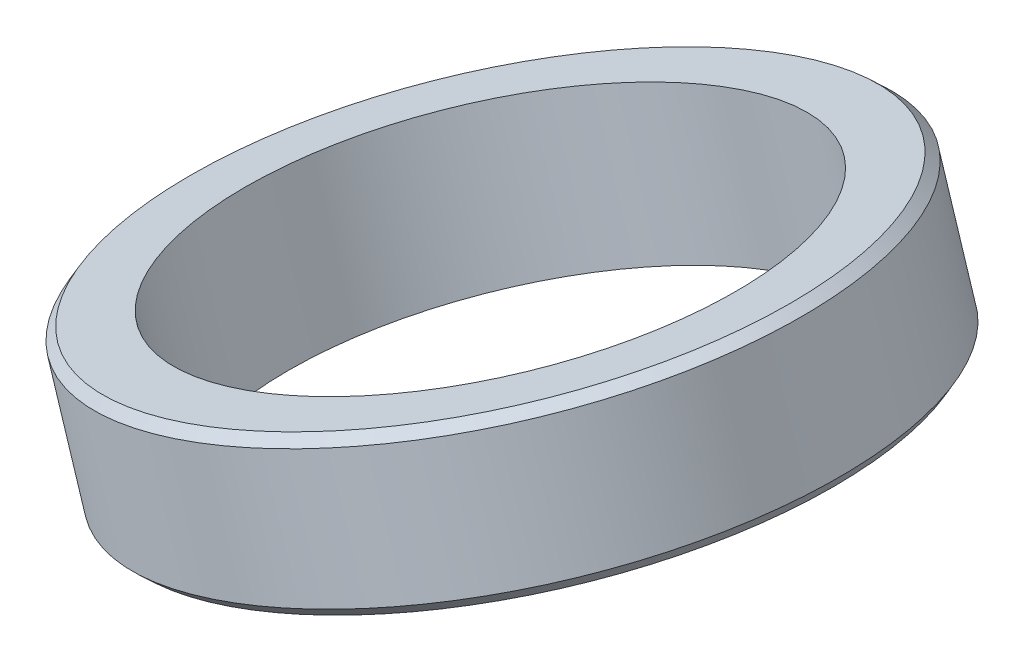
ISO-10303-21;
HEADER;
FILE_DESCRIPTION(('STEP AP214'),'2;1');
FILE_NAME('part.step','',(''),(''),'','','');
FILE_SCHEMA(('AUTOMOTIVE_DESIGN { 1 0 10303 214 1 1 1 1 }'));
ENDSEC;
DATA;
#1=APPLICATION_CONTEXT('core data for automotive mechanical design processes');
#2=APPLICATION_PROTOCOL_DEFINITION('international standard','automotive_design',2000,#1);
#3=PRODUCT_CONTEXT('',#1,'mechanical');
#4=PRODUCT('Part','Part','',(#3));
#5=PRODUCT_RELATED_PRODUCT_CATEGORY('part','',(#4));
#6=PRODUCT_DEFINITION_FORMATION('','',#4);
#7=PRODUCT_DEFINITION_CONTEXT('part definition',#1,'design');
#8=PRODUCT_DEFINITION('design','',#6,#7);
#9=PRODUCT_DEFINITION_SHAPE('','',#8);
#10=(LENGTH_UNIT() NAMED_UNIT(*) SI_UNIT(.MILLI.,.METRE.));
#11=(NAMED_UNIT(*) PLANE_ANGLE_UNIT() SI_UNIT($,.RADIAN.));
#12=(NAMED_UNIT(*) SI_UNIT($,.STERADIAN.) SOLID_ANGLE_UNIT());
#13=UNCERTAINTY_MEASURE_WITH_UNIT(LENGTH_MEASURE(1.E-05),#10,'distance_accuracy_value','');
#14=(GEOMETRIC_REPRESENTATION_CONTEXT(3) GLOBAL_UNCERTAINTY_ASSIGNED_CONTEXT((#13)) GLOBAL_UNIT_ASSIGNED_CONTEXT((#10,
#11,#12)) REPRESENTATION_CONTEXT('',''));
#15=CARTESIAN_POINT('',(0.,0.,0.));
#16=DIRECTION('',(0.,0.,1.));
#17=DIRECTION('',(1.,0.,0.));
#18=AXIS2_PLACEMENT_3D('',#15,#16,#17);
#19=CARTESIAN_POINT('',(355.271428694169,565.0485710393,0.));
#20=DIRECTION('',(-0.300714282645771,0.953714275982508,0.));
#21=DIRECTION('',(-0.953714275982508,-0.300714282645771,0.));
#22=AXIS2_PLACEMENT_3D('',#19,#20,#21);
#23=CYLINDRICAL_SURFACE('',#22,14.3);
#24=CARTESIAN_POINT('',(359.180714368564,552.650285451528,0.));
#25=DIRECTION('',(-0.300714282645771,0.953714275982508,0.));
#26=DIRECTION('',(-0.953714275982508,-0.300714282645771,0.));
#27=AXIS2_PLACEMENT_3D('',#24,#25,#26);
#28=CIRCLE('',#27,14.3);
#29=CARTESIAN_POINT('',(345.542600222014,548.350071209693,0.));
#30=VERTEX_POINT('',#29);
#31=EDGE_CURVE('E55',#30,#30,#28,.T.);
#32=ORIENTED_EDGE('',*,*,#31,.F.);
#33=EDGE_LOOP('',(#32));
#34=FACE_BOUND('',#33,.T.);
#35=CARTESIAN_POINT('',(356.775000107398,560.279999659388,0.));
#36=DIRECTION('',(-0.300714282645771,0.953714275982508,0.));
#37=DIRECTION('',(-0.953714275982508,-0.300714282645771,0.));
#38=AXIS2_PLACEMENT_3D('',#35,#36,#37);
#39=CIRCLE('',#38,14.3);
#40=CARTESIAN_POINT('',(343.136885960848,555.979785417553,0.));
#41=VERTEX_POINT('',#40);
#42=EDGE_CURVE('E10',#41,#41,#39,.T.);
#43=ORIENTED_EDGE('',*,*,#42,.T.);
#44=EDGE_LOOP('',(#43));
#45=FACE_BOUND('',#44,.T.);
#46=ADVANCED_FACE('F33',(#34,#45),#23,.F.);
#47=CARTESIAN_POINT('',(370.413114253948,564.580213901222,0.));
#48=DIRECTION('',(0.300714282645771,-0.953714275982508,0.));
#49=DIRECTION('',(0.953714275982508,0.300714282645771,0.));
#50=AXIS2_PLACEMENT_3D('',#47,#48,#49);
#51=PLANE('',#50);
#52=ORIENTED_EDGE('',*,*,#42,.F.);
#53=EDGE_LOOP('',(#52));
#54=FACE_BOUND('',#53,.T.);
#55=CARTESIAN_POINT('',(356.775000107398,560.279999659388,0.));
#56=DIRECTION('',(-0.300714282645771,0.953714275982508,0.));
#57=DIRECTION('',(-0.953714275982508,-0.300714282645771,0.));
#58=AXIS2_PLACEMENT_3D('',#55,#56,#57);
#59=CIRCLE('',#58,17.5);
#60=CARTESIAN_POINT('',(340.085000277704,555.017499713087,0.));
#61=VERTEX_POINT('',#60);
#62=EDGE_CURVE('E39',#61,#61,#59,.T.);
#63=ORIENTED_EDGE('',*,*,#62,.T.);
#64=EDGE_LOOP('',(#63));
#65=FACE_BOUND('',#64,.T.);
#66=ADVANCED_FACE('F62',(#54,#65),#51,.F.);
#67=CARTESIAN_POINT('',(356.925357248721,559.803142521396,0.));
#68=DIRECTION('',(0.300714282645771,-0.953714275982508,0.));
#69=DIRECTION('',(0.953714275982508,0.300714282645771,0.));
#70=AXIS2_PLACEMENT_3D('',#67,#68,#69);
#71=CONICAL_SURFACE('',#70,18.,0.785398163397482);
#72=ORIENTED_EDGE('',*,*,#62,.F.);
#73=EDGE_LOOP('',(#72));
#74=FACE_BOUND('',#73,.T.);
#75=CARTESIAN_POINT('',(356.925357248721,559.803142521396,0.));
#76=DIRECTION('',(-0.300714282645771,0.953714275982508,0.));
#77=DIRECTION('',(-0.953714275982508,-0.300714282645771,0.));
#78=AXIS2_PLACEMENT_3D('',#75,#76,#77);
#79=CIRCLE('',#78,18.);
#80=CARTESIAN_POINT('',(339.758500281036,554.390285433773,0.));
#81=VERTEX_POINT('',#80);
#82=EDGE_CURVE('E43',#81,#81,#79,.T.);
#83=ORIENTED_EDGE('',*,*,#82,.T.);
#84=EDGE_LOOP('',(#83));
#85=FACE_BOUND('',#84,.T.);
#86=ADVANCED_FACE('F66',(#74,#85),#71,.T.);
#87=CARTESIAN_POINT('',(355.271428694169,565.0485710393,0.));
#88=DIRECTION('',(-0.300714282645771,0.953714275982508,0.));
#89=DIRECTION('',(-0.953714275982508,-0.300714282645771,0.));
#90=AXIS2_PLACEMENT_3D('',#87,#88,#89);
#91=CYLINDRICAL_SURFACE('',#90,18.);
#92=ORIENTED_EDGE('',*,*,#82,.F.);
#93=EDGE_LOOP('',(#92));
#94=FACE_BOUND('',#93,.T.);
#95=CARTESIAN_POINT('',(359.030357227241,553.127142589519,0.));
#96=DIRECTION('',(-0.300714282645771,0.953714275982508,0.));
#97=DIRECTION('',(-0.953714275982508,-0.300714282645771,0.));
#98=AXIS2_PLACEMENT_3D('',#95,#96,#97);
#99=CIRCLE('',#98,18.);
#100=CARTESIAN_POINT('',(341.863500259556,547.714285501895,0.));
#101=VERTEX_POINT('',#100);
#102=EDGE_CURVE('E47',#101,#101,#99,.T.);
#103=ORIENTED_EDGE('',*,*,#102,.T.);
#104=EDGE_LOOP('',(#103));
#105=FACE_BOUND('',#104,.T.);
#106=ADVANCED_FACE('F71',(#94,#105),#91,.T.);
#107=CARTESIAN_POINT('',(359.180714368564,552.650285451528,0.));
#108=DIRECTION('',(-0.300714282645771,0.953714275982508,0.));
#109=DIRECTION('',(-0.953714275982508,-0.300714282645771,0.));
#110=AXIS2_PLACEMENT_3D('',#107,#108,#109);
#111=CONICAL_SURFACE('',#110,17.5,0.785398163397326);
#112=ORIENTED_EDGE('',*,*,#102,.F.);
#113=EDGE_LOOP('',(#112));
#114=FACE_BOUND('',#113,.T.);
#115=CARTESIAN_POINT('',(359.180714368564,552.650285451528,0.));
#116=DIRECTION('',(-0.300714282645771,0.953714275982508,0.));
#117=DIRECTION('',(-0.953714275982508,-0.300714282645771,0.));
#118=AXIS2_PLACEMENT_3D('',#115,#116,#117);
#119=CIRCLE('',#118,17.5);
#120=CARTESIAN_POINT('',(342.49071453887,547.387785505227,0.));
#121=VERTEX_POINT('',#120);
#122=EDGE_CURVE('E52',#121,#121,#119,.T.);
#123=ORIENTED_EDGE('',*,*,#122,.T.);
#124=EDGE_LOOP('',(#123));
#125=FACE_BOUND('',#124,.T.);
#126=ADVANCED_FACE('F77',(#114,#125),#111,.T.);
#127=CARTESIAN_POINT('',(375.870714198258,557.912785397829,0.));
#128=DIRECTION('',(-0.300714282645771,0.953714275982508,0.));
#129=DIRECTION('',(-0.953714275982508,-0.300714282645771,0.));
#130=AXIS2_PLACEMENT_3D('',#127,#128,#129);
#131=PLANE('',#130);
#132=ORIENTED_EDGE('',*,*,#122,.F.);
#133=EDGE_LOOP('',(#132));
#134=FACE_BOUND('',#133,.T.);
#135=ORIENTED_EDGE('',*,*,#31,.T.);
#136=EDGE_LOOP('',(#135));
#137=FACE_BOUND('',#136,.T.);
#138=ADVANCED_FACE('F59',(#134,#137),#131,.F.);
#139=CLOSED_SHELL('',(#46,#66,#86,#106,#126,#138));
#140=MANIFOLD_SOLID_BREP('B2',#139);
#141=ADVANCED_BREP_SHAPE_REPRESENTATION('',(#18,#140),#14);
#142=SHAPE_DEFINITION_REPRESENTATION(#9,#141);
ENDSEC;
END-ISO-10303-21;
